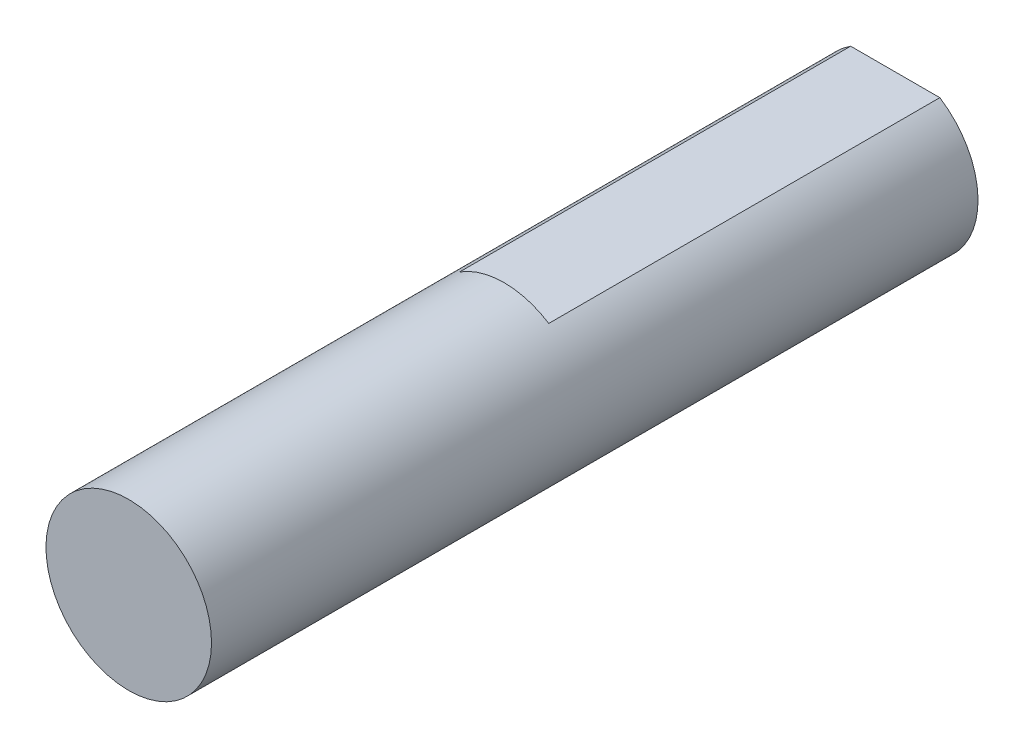
ISO-10303-21;
HEADER;
FILE_DESCRIPTION(('STEP AP214'),'2;1');
FILE_NAME('part.step','',(''),(''),'','','');
FILE_SCHEMA(('AUTOMOTIVE_DESIGN { 1 0 10303 214 1 1 1 1 }'));
ENDSEC;
DATA;
#1=APPLICATION_CONTEXT('core data for automotive mechanical design processes');
#2=APPLICATION_PROTOCOL_DEFINITION('international standard','automotive_design',2000,#1);
#3=PRODUCT_CONTEXT('',#1,'mechanical');
#4=PRODUCT('Part','Part','',(#3));
#5=PRODUCT_RELATED_PRODUCT_CATEGORY('part','',(#4));
#6=PRODUCT_DEFINITION_FORMATION('','',#4);
#7=PRODUCT_DEFINITION_CONTEXT('part definition',#1,'design');
#8=PRODUCT_DEFINITION('design','',#6,#7);
#9=PRODUCT_DEFINITION_SHAPE('','',#8);
#10=(LENGTH_UNIT() NAMED_UNIT(*) SI_UNIT(.MILLI.,.METRE.));
#11=(NAMED_UNIT(*) PLANE_ANGLE_UNIT() SI_UNIT($,.RADIAN.));
#12=(NAMED_UNIT(*) SI_UNIT($,.STERADIAN.) SOLID_ANGLE_UNIT());
#13=UNCERTAINTY_MEASURE_WITH_UNIT(LENGTH_MEASURE(1.E-05),#10,'distance_accuracy_value','');
#14=(GEOMETRIC_REPRESENTATION_CONTEXT(3) GLOBAL_UNCERTAINTY_ASSIGNED_CONTEXT((#13)) GLOBAL_UNIT_ASSIGNED_CONTEXT((#10,
#11,#12)) REPRESENTATION_CONTEXT('',''));
#15=CARTESIAN_POINT('',(0.,0.,0.));
#16=DIRECTION('',(0.,0.,1.));
#17=DIRECTION('',(1.,0.,0.));
#18=AXIS2_PLACEMENT_3D('',#15,#16,#17);
#19=CARTESIAN_POINT('',(0.,0.,29.4));
#20=DIRECTION('',(0.,0.,-1.));
#21=DIRECTION('',(-1.,0.,0.));
#22=AXIS2_PLACEMENT_3D('',#19,#20,#21);
#23=CYLINDRICAL_SURFACE('',#22,3.175);
#24=CARTESIAN_POINT('',(0.,0.,29.4));
#25=DIRECTION('',(0.,0.,1.));
#26=DIRECTION('',(1.,0.,0.));
#27=AXIS2_PLACEMENT_3D('',#24,#25,#26);
#28=CIRCLE('',#27,3.175);
#29=CARTESIAN_POINT('',(3.175,0.,29.4));
#30=VERTEX_POINT('',#29);
#31=EDGE_CURVE('E11',#30,#30,#28,.T.);
#32=ORIENTED_EDGE('',*,*,#31,.F.);
#33=EDGE_LOOP('',(#32));
#34=FACE_BOUND('',#33,.T.);
#35=DIRECTION('',(0.,0.,-1.));
#36=VECTOR('',#35,1.);
#37=CARTESIAN_POINT('',(1.71026313764871,2.675,15.));
#38=LINE('',#37,#36);
#39=CARTESIAN_POINT('',(1.71026313764871,2.675,15.));
#40=VERTEX_POINT('',#39);
#41=CARTESIAN_POINT('',(1.71026313764871,2.675,0.));
#42=VERTEX_POINT('',#41);
#43=EDGE_CURVE('E49',#40,#42,#38,.T.);
#44=ORIENTED_EDGE('',*,*,#43,.F.);
#45=CARTESIAN_POINT('',(0.,0.,15.));
#46=DIRECTION('',(0.,0.,1.));
#47=DIRECTION('',(1.,0.,0.));
#48=AXIS2_PLACEMENT_3D('',#45,#46,#47);
#49=CIRCLE('',#48,3.175);
#50=CARTESIAN_POINT('',(-1.71026313764871,2.675,15.));
#51=VERTEX_POINT('',#50);
#52=EDGE_CURVE('E69',#40,#51,#49,.T.);
#53=ORIENTED_EDGE('',*,*,#52,.T.);
#54=DIRECTION('',(0.,0.,-1.));
#55=VECTOR('',#54,1.);
#56=CARTESIAN_POINT('',(-1.71026313764871,2.675,15.));
#57=LINE('',#56,#55);
#58=CARTESIAN_POINT('',(-1.71026313764871,2.675,0.));
#59=VERTEX_POINT('',#58);
#60=EDGE_CURVE('E55',#51,#59,#57,.T.);
#61=ORIENTED_EDGE('',*,*,#60,.T.);
#62=CARTESIAN_POINT('',(0.,0.,0.));
#63=DIRECTION('',(0.,0.,1.));
#64=DIRECTION('',(1.,0.,0.));
#65=AXIS2_PLACEMENT_3D('',#62,#63,#64);
#66=CIRCLE('',#65,3.175);
#67=EDGE_CURVE('E38',#59,#42,#66,.T.);
#68=ORIENTED_EDGE('',*,*,#67,.T.);
#69=EDGE_LOOP('',(#44,#53,#61,#68));
#70=FACE_BOUND('',#69,.T.);
#71=ADVANCED_FACE('F35',(#34,#70),#23,.T.);
#72=CARTESIAN_POINT('',(0.,0.,0.));
#73=DIRECTION('',(0.,0.,1.));
#74=DIRECTION('',(1.,0.,0.));
#75=AXIS2_PLACEMENT_3D('',#72,#73,#74);
#76=PLANE('',#75);
#77=DIRECTION('',(1.,0.,0.));
#78=VECTOR('',#77,1.);
#79=CARTESIAN_POINT('',(0.,2.675,0.));
#80=LINE('',#79,#78);
#81=EDGE_CURVE('E60',#59,#42,#80,.T.);
#82=ORIENTED_EDGE('',*,*,#81,.T.);
#83=ORIENTED_EDGE('',*,*,#67,.F.);
#84=EDGE_LOOP('',(#82,#83));
#85=FACE_BOUND('',#84,.T.);
#86=ADVANCED_FACE('F71',(#85),#76,.F.);
#87=CARTESIAN_POINT('',(0.,0.,29.4));
#88=DIRECTION('',(0.,0.,1.));
#89=DIRECTION('',(1.,0.,0.));
#90=AXIS2_PLACEMENT_3D('',#87,#88,#89);
#91=PLANE('',#90);
#92=ORIENTED_EDGE('',*,*,#31,.T.);
#93=EDGE_LOOP('',(#92));
#94=FACE_BOUND('',#93,.T.);
#95=ADVANCED_FACE('F82',(#94),#91,.T.);
#96=CARTESIAN_POINT('',(0.,2.675,15.));
#97=DIRECTION('',(0.,1.,0.));
#98=DIRECTION('',(0.,0.,1.));
#99=AXIS2_PLACEMENT_3D('',#96,#97,#98);
#100=PLANE('',#99);
#101=ORIENTED_EDGE('',*,*,#81,.F.);
#102=ORIENTED_EDGE('',*,*,#60,.F.);
#103=DIRECTION('',(1.,0.,0.));
#104=VECTOR('',#103,1.);
#105=CARTESIAN_POINT('',(0.,2.675,15.));
#106=LINE('',#105,#104);
#107=EDGE_CURVE('E65',#51,#40,#106,.T.);
#108=ORIENTED_EDGE('',*,*,#107,.T.);
#109=ORIENTED_EDGE('',*,*,#43,.T.);
#110=EDGE_LOOP('',(#101,#102,#108,#109));
#111=FACE_BOUND('',#110,.T.);
#112=ADVANCED_FACE('F61',(#111),#100,.T.);
#113=CARTESIAN_POINT('',(0.,0.,15.));
#114=DIRECTION('',(0.,0.,1.));
#115=DIRECTION('',(1.,0.,0.));
#116=AXIS2_PLACEMENT_3D('',#113,#114,#115);
#117=PLANE('',#116);
#118=ORIENTED_EDGE('',*,*,#107,.F.);
#119=ORIENTED_EDGE('',*,*,#52,.F.);
#120=EDGE_LOOP('',(#118,#119));
#121=FACE_BOUND('',#120,.T.);
#122=ADVANCED_FACE('F76',(#121),#117,.F.);
#123=CLOSED_SHELL('',(#71,#86,#95,#112,#122));
#124=MANIFOLD_SOLID_BREP('B2',#123);
#125=ADVANCED_BREP_SHAPE_REPRESENTATION('',(#18,#124),#14);
#126=SHAPE_DEFINITION_REPRESENTATION(#9,#125);
ENDSEC;
END-ISO-10303-21;
